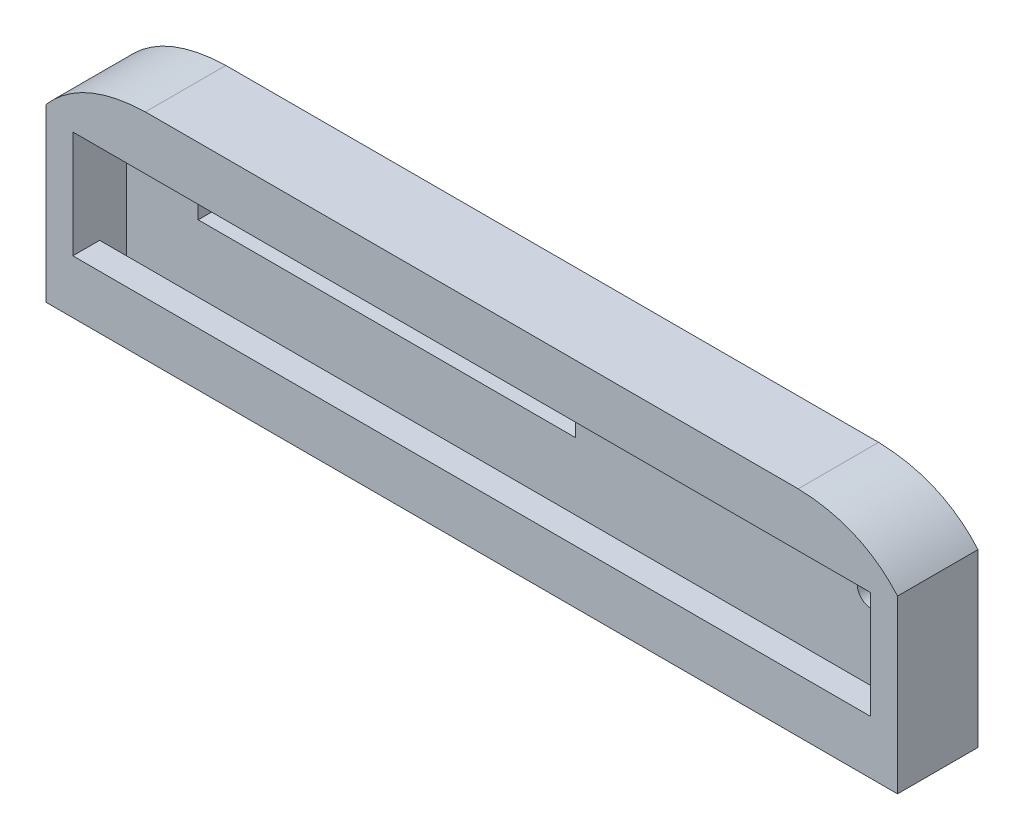
ISO-10303-21;
HEADER;
FILE_DESCRIPTION(('STEP AP214'),'2;1');
FILE_NAME('part.step','',(''),(''),'','','');
FILE_SCHEMA(('AUTOMOTIVE_DESIGN { 1 0 10303 214 1 1 1 1 }'));
ENDSEC;
DATA;
#1=APPLICATION_CONTEXT('core data for automotive mechanical design processes');
#2=APPLICATION_PROTOCOL_DEFINITION('international standard','automotive_design',2000,#1);
#3=PRODUCT_CONTEXT('',#1,'mechanical');
#4=PRODUCT('Part','Part','',(#3));
#5=PRODUCT_RELATED_PRODUCT_CATEGORY('part','',(#4));
#6=PRODUCT_DEFINITION_FORMATION('','',#4);
#7=PRODUCT_DEFINITION_CONTEXT('part definition',#1,'design');
#8=PRODUCT_DEFINITION('design','',#6,#7);
#9=PRODUCT_DEFINITION_SHAPE('','',#8);
#10=(LENGTH_UNIT() NAMED_UNIT(*) SI_UNIT(.MILLI.,.METRE.));
#11=(NAMED_UNIT(*) PLANE_ANGLE_UNIT() SI_UNIT($,.RADIAN.));
#12=(NAMED_UNIT(*) SI_UNIT($,.STERADIAN.) SOLID_ANGLE_UNIT());
#13=UNCERTAINTY_MEASURE_WITH_UNIT(LENGTH_MEASURE(1.E-05),#10,'distance_accuracy_value','');
#14=(GEOMETRIC_REPRESENTATION_CONTEXT(3) GLOBAL_UNCERTAINTY_ASSIGNED_CONTEXT((#13)) GLOBAL_UNIT_ASSIGNED_CONTEXT((#10,
#11,#12)) REPRESENTATION_CONTEXT('',''));
#15=CARTESIAN_POINT('',(0.,0.,0.));
#16=DIRECTION('',(0.,0.,1.));
#17=DIRECTION('',(1.,0.,0.));
#18=AXIS2_PLACEMENT_3D('',#15,#16,#17);
#19=CARTESIAN_POINT('',(31.75,-8.,2.));
#20=DIRECTION('',(-1.,0.,0.));
#21=DIRECTION('',(0.,0.,1.));
#22=AXIS2_PLACEMENT_3D('',#19,#20,#21);
#23=PLANE('',#22);
#24=DIRECTION('',(0.,0.,-1.));
#25=VECTOR('',#24,1.);
#26=CARTESIAN_POINT('',(31.75,4.77723529661171,6.));
#27=LINE('',#26,#25);
#28=CARTESIAN_POINT('',(31.75,4.77723529661171,6.));
#29=VERTEX_POINT('',#28);
#30=CARTESIAN_POINT('',(31.75,4.77723529661171,-1.49186218934005E-13));
#31=VERTEX_POINT('',#30);
#32=EDGE_CURVE('E171',#29,#31,#27,.T.);
#33=ORIENTED_EDGE('',*,*,#32,.F.);
#34=DIRECTION('',(0.,1.,0.));
#35=VECTOR('',#34,1.);
#36=CARTESIAN_POINT('',(31.75,8.,6.));
#37=LINE('',#36,#35);
#38=CARTESIAN_POINT('',(31.75,-8.,6.));
#39=VERTEX_POINT('',#38);
#40=EDGE_CURVE('E183',#39,#29,#37,.T.);
#41=ORIENTED_EDGE('',*,*,#40,.F.);
#42=DIRECTION('',(0.,0.,-1.));
#43=VECTOR('',#42,1.);
#44=CARTESIAN_POINT('',(31.75,-8.,2.));
#45=LINE('',#44,#43);
#46=CARTESIAN_POINT('',(31.75,-8.,0.));
#47=VERTEX_POINT('',#46);
#48=EDGE_CURVE('E267',#39,#47,#45,.T.);
#49=ORIENTED_EDGE('',*,*,#48,.T.);
#50=DIRECTION('',(0.,1.,0.));
#51=VECTOR('',#50,1.);
#52=CARTESIAN_POINT('',(31.75,-8.,0.));
#53=LINE('',#52,#51);
#54=EDGE_CURVE('E185',#47,#31,#53,.T.);
#55=ORIENTED_EDGE('',*,*,#54,.T.);
#56=EDGE_LOOP('',(#33,#41,#49,#55));
#57=FACE_BOUND('',#56,.T.);
#58=ADVANCED_FACE('F45',(#57),#23,.F.);
#59=CARTESIAN_POINT('',(-31.75,8.,2.));
#60=DIRECTION('',(0.,-1.,0.));
#61=DIRECTION('',(0.,0.,-1.));
#62=AXIS2_PLACEMENT_3D('',#59,#60,#61);
#63=PLANE('',#62);
#64=DIRECTION('',(0.,0.,-1.));
#65=VECTOR('',#64,1.);
#66=CARTESIAN_POINT('',(24.3400578712769,8.00000000000037,6.));
#67=LINE('',#66,#65);
#68=CARTESIAN_POINT('',(24.3400578712895,8.,6.));
#69=VERTEX_POINT('',#68);
#70=CARTESIAN_POINT('',(24.3400578712769,8.00000000000037,-1.49186218934005E-13));
#71=VERTEX_POINT('',#70);
#72=EDGE_CURVE('E60',#69,#71,#67,.T.);
#73=ORIENTED_EDGE('',*,*,#72,.T.);
#74=DIRECTION('',(-1.,0.,0.));
#75=VECTOR('',#74,1.);
#76=CARTESIAN_POINT('',(-31.75,8.,0.));
#77=LINE('',#76,#75);
#78=CARTESIAN_POINT('',(-24.3400578712769,8.00000000000037,-1.49186218934005E-13));
#79=VERTEX_POINT('',#78);
#80=EDGE_CURVE('E258',#71,#79,#77,.T.);
#81=ORIENTED_EDGE('',*,*,#80,.T.);
#82=DIRECTION('',(0.,0.,-1.));
#83=VECTOR('',#82,1.);
#84=CARTESIAN_POINT('',(-24.3400578712769,8.00000000000037,6.));
#85=LINE('',#84,#83);
#86=CARTESIAN_POINT('',(-24.3400578712769,8.00000000000037,6.));
#87=VERTEX_POINT('',#86);
#88=EDGE_CURVE('E598',#87,#79,#85,.T.);
#89=ORIENTED_EDGE('',*,*,#88,.F.);
#90=DIRECTION('',(-1.,0.,0.));
#91=VECTOR('',#90,1.);
#92=CARTESIAN_POINT('',(-31.75,8.,6.));
#93=LINE('',#92,#91);
#94=EDGE_CURVE('E193',#69,#87,#93,.T.);
#95=ORIENTED_EDGE('',*,*,#94,.F.);
#96=EDGE_LOOP('',(#73,#81,#89,#95));
#97=FACE_BOUND('',#96,.T.);
#98=ADVANCED_FACE('F400',(#97),#63,.F.);
#99=CARTESIAN_POINT('',(0.,0.,0.));
#100=DIRECTION('',(0.,0.,-1.));
#101=DIRECTION('',(-1.,0.,0.));
#102=AXIS2_PLACEMENT_3D('',#99,#100,#101);
#103=PLANE('',#102);
#104=DIRECTION('',(0.,-1.,0.));
#105=VECTOR('',#104,1.);
#106=CARTESIAN_POINT('',(3.74999999999999,-1.,0.));
#107=LINE('',#106,#105);
#108=CARTESIAN_POINT('',(3.74999999999999,1.,0.));
#109=VERTEX_POINT('',#108);
#110=CARTESIAN_POINT('',(3.74999999999999,-1.,0.));
#111=VERTEX_POINT('',#110);
#112=EDGE_CURVE('E611',#109,#111,#107,.T.);
#113=ORIENTED_EDGE('',*,*,#112,.F.);
#114=DIRECTION('',(1.,0.,0.));
#115=VECTOR('',#114,1.);
#116=CARTESIAN_POINT('',(3.74999999999999,1.,0.));
#117=LINE('',#116,#115);
#118=CARTESIAN_POINT('',(-24.4,1.,0.));
#119=VERTEX_POINT('',#118);
#120=EDGE_CURVE('E314',#119,#109,#117,.T.);
#121=ORIENTED_EDGE('',*,*,#120,.F.);
#122=DIRECTION('',(0.,1.,0.));
#123=VECTOR('',#122,1.);
#124=CARTESIAN_POINT('',(-24.4,-1.,0.));
#125=LINE('',#124,#123);
#126=CARTESIAN_POINT('',(-24.4,-1.,0.));
#127=VERTEX_POINT('',#126);
#128=EDGE_CURVE('E298',#127,#119,#125,.T.);
#129=ORIENTED_EDGE('',*,*,#128,.F.);
#130=DIRECTION('',(-1.,0.,0.));
#131=VECTOR('',#130,1.);
#132=CARTESIAN_POINT('',(3.74999999999999,-1.,0.));
#133=LINE('',#132,#131);
#134=EDGE_CURVE('E617',#111,#127,#133,.T.);
#135=ORIENTED_EDGE('',*,*,#134,.F.);
#136=EDGE_LOOP('',(#113,#121,#129,#135));
#137=FACE_BOUND('',#136,.T.);
#138=CARTESIAN_POINT('',(25.75,0.,0.));
#139=DIRECTION('',(0.,0.,1.));
#140=DIRECTION('',(1.,0.,0.));
#141=AXIS2_PLACEMENT_3D('',#138,#139,#140);
#142=CIRCLE('',#141,1.);
#143=CARTESIAN_POINT('',(26.75,0.,0.));
#144=VERTEX_POINT('',#143);
#145=EDGE_CURVE('E315',#144,#144,#142,.T.);
#146=ORIENTED_EDGE('',*,*,#145,.T.);
#147=EDGE_LOOP('',(#146));
#148=FACE_BOUND('',#147,.T.);
#149=ORIENTED_EDGE('',*,*,#80,.F.);
#150=CARTESIAN_POINT('',(23.4154374120693,8.00000000000037,-1.49186218934005E-13));
#151=CARTESIAN_POINT('',(28.8241821677392,8.15397580763855,-1.49186218934005E-13));
#152=CARTESIAN_POINT('',(31.75,4.77723529661171,-1.49186218934005E-13));
#153=B_SPLINE_CURVE_WITH_KNOTS('',2,(#150,#151,#152),.UNSPECIFIED.,.F.,.F.,(3,3),(0.,1.),.UNSPECIFIED.);
#154=EDGE_CURVE('E177',#71,#31,#153,.T.);
#155=ORIENTED_EDGE('',*,*,#154,.T.);
#156=ORIENTED_EDGE('',*,*,#54,.F.);
#157=DIRECTION('',(1.,0.,0.));
#158=VECTOR('',#157,1.);
#159=CARTESIAN_POINT('',(-31.75,-8.,0.));
#160=LINE('',#159,#158);
#161=CARTESIAN_POINT('',(-31.75,-8.,0.));
#162=VERTEX_POINT('',#161);
#163=EDGE_CURVE('E264',#162,#47,#160,.T.);
#164=ORIENTED_EDGE('',*,*,#163,.F.);
#165=DIRECTION('',(0.,-1.,0.));
#166=VECTOR('',#165,1.);
#167=CARTESIAN_POINT('',(-31.75,-8.,0.));
#168=LINE('',#167,#166);
#169=CARTESIAN_POINT('',(-31.75,4.77723529661171,-1.49186218934005E-13));
#170=VERTEX_POINT('',#169);
#171=EDGE_CURVE('E261',#170,#162,#168,.T.);
#172=ORIENTED_EDGE('',*,*,#171,.F.);
#173=CARTESIAN_POINT('',(-23.4154374120693,8.00000000000037,-1.49186218934005E-13));
#174=CARTESIAN_POINT('',(-28.8241821677392,8.15397580763855,-1.49186218934005E-13));
#175=CARTESIAN_POINT('',(-31.75,4.77723529661171,-1.49186218934005E-13));
#176=B_SPLINE_CURVE_WITH_KNOTS('',2,(#173,#174,#175),.UNSPECIFIED.,.F.,.F.,(3,3),(0.,1.),.UNSPECIFIED.);
#177=EDGE_CURVE('E591',#79,#170,#176,.T.);
#178=ORIENTED_EDGE('',*,*,#177,.F.);
#179=EDGE_LOOP('',(#149,#155,#156,#164,#172,#178));
#180=FACE_BOUND('',#179,.T.);
#181=ADVANCED_FACE('F390',(#137,#148,#180),#103,.T.);
#182=CARTESIAN_POINT('',(0.,0.,6.));
#183=DIRECTION('',(0.,0.,1.));
#184=DIRECTION('',(1.,0.,0.));
#185=AXIS2_PLACEMENT_3D('',#182,#183,#184);
#186=PLANE('',#185);
#187=DIRECTION('',(-1.,0.,0.));
#188=VECTOR('',#187,1.);
#189=CARTESIAN_POINT('',(-29.75,4.,6.));
#190=LINE('',#189,#188);
#191=CARTESIAN_POINT('',(29.75,4.,6.));
#192=VERTEX_POINT('',#191);
#193=CARTESIAN_POINT('',(-29.75,4.,6.));
#194=VERTEX_POINT('',#193);
#195=EDGE_CURVE('E326',#192,#194,#190,.T.);
#196=ORIENTED_EDGE('',*,*,#195,.F.);
#197=DIRECTION('',(0.,1.,0.));
#198=VECTOR('',#197,1.);
#199=CARTESIAN_POINT('',(29.75,4.,6.));
#200=LINE('',#199,#198);
#201=CARTESIAN_POINT('',(29.75,-4.,6.));
#202=VERTEX_POINT('',#201);
#203=EDGE_CURVE('E323',#202,#192,#200,.T.);
#204=ORIENTED_EDGE('',*,*,#203,.F.);
#205=DIRECTION('',(1.,0.,0.));
#206=VECTOR('',#205,1.);
#207=CARTESIAN_POINT('',(-29.75,-4.,6.));
#208=LINE('',#207,#206);
#209=CARTESIAN_POINT('',(-29.75,-4.,6.));
#210=VERTEX_POINT('',#209);
#211=EDGE_CURVE('E334',#210,#202,#208,.T.);
#212=ORIENTED_EDGE('',*,*,#211,.F.);
#213=DIRECTION('',(0.,-1.,0.));
#214=VECTOR('',#213,1.);
#215=CARTESIAN_POINT('',(-29.75,4.,6.));
#216=LINE('',#215,#214);
#217=EDGE_CURVE('E330',#194,#210,#216,.T.);
#218=ORIENTED_EDGE('',*,*,#217,.F.);
#219=EDGE_LOOP('',(#196,#204,#212,#218));
#220=FACE_BOUND('',#219,.T.);
#221=ORIENTED_EDGE('',*,*,#40,.T.);
#222=CARTESIAN_POINT('',(23.4154374120693,8.00000000000037,6.));
#223=CARTESIAN_POINT('',(28.8241821677392,8.15397580763855,6.));
#224=CARTESIAN_POINT('',(31.75,4.77723529661171,6.));
#225=B_SPLINE_CURVE_WITH_KNOTS('',2,(#222,#223,#224),.UNSPECIFIED.,.F.,.F.,(3,3),(0.,1.),.UNSPECIFIED.);
#226=EDGE_CURVE('E168',#69,#29,#225,.T.);
#227=ORIENTED_EDGE('',*,*,#226,.F.);
#228=ORIENTED_EDGE('',*,*,#94,.T.);
#229=CARTESIAN_POINT('',(-23.4154374120693,8.00000000000037,6.));
#230=CARTESIAN_POINT('',(-28.8241821677392,8.15397580763855,6.));
#231=CARTESIAN_POINT('',(-31.75,4.77723529661171,6.));
#232=B_SPLINE_CURVE_WITH_KNOTS('',2,(#229,#230,#231),.UNSPECIFIED.,.F.,.F.,(3,3),(0.,1.),.UNSPECIFIED.);
#233=CARTESIAN_POINT('',(-31.75,4.77723529661171,6.));
#234=VERTEX_POINT('',#233);
#235=EDGE_CURVE('E592',#87,#234,#232,.T.);
#236=ORIENTED_EDGE('',*,*,#235,.T.);
#237=DIRECTION('',(0.,-1.,0.));
#238=VECTOR('',#237,1.);
#239=CARTESIAN_POINT('',(-31.75,8.,6.));
#240=LINE('',#239,#238);
#241=CARTESIAN_POINT('',(-31.75,-8.,6.));
#242=VERTEX_POINT('',#241);
#243=EDGE_CURVE('E198',#234,#242,#240,.T.);
#244=ORIENTED_EDGE('',*,*,#243,.T.);
#245=DIRECTION('',(1.,0.,0.));
#246=VECTOR('',#245,1.);
#247=CARTESIAN_POINT('',(-31.75,-8.,6.));
#248=LINE('',#247,#246);
#249=EDGE_CURVE('E191',#242,#39,#248,.T.);
#250=ORIENTED_EDGE('',*,*,#249,.T.);
#251=EDGE_LOOP('',(#221,#227,#228,#236,#244,#250));
#252=FACE_BOUND('',#251,.T.);
#253=ADVANCED_FACE('F189',(#220,#252),#186,.T.);
#254=CARTESIAN_POINT('',(-31.75,-8.,2.));
#255=DIRECTION('',(1.,0.,0.));
#256=DIRECTION('',(0.,0.,-1.));
#257=AXIS2_PLACEMENT_3D('',#254,#255,#256);
#258=PLANE('',#257);
#259=ORIENTED_EDGE('',*,*,#243,.F.);
#260=DIRECTION('',(0.,0.,-1.));
#261=VECTOR('',#260,1.);
#262=CARTESIAN_POINT('',(-31.75,4.77723529661171,6.));
#263=LINE('',#262,#261);
#264=EDGE_CURVE('E68',#234,#170,#263,.T.);
#265=ORIENTED_EDGE('',*,*,#264,.T.);
#266=ORIENTED_EDGE('',*,*,#171,.T.);
#267=DIRECTION('',(0.,0.,-1.));
#268=VECTOR('',#267,1.);
#269=CARTESIAN_POINT('',(-31.75,-8.,2.));
#270=LINE('',#269,#268);
#271=EDGE_CURVE('E270',#242,#162,#270,.T.);
#272=ORIENTED_EDGE('',*,*,#271,.F.);
#273=EDGE_LOOP('',(#259,#265,#266,#272));
#274=FACE_BOUND('',#273,.T.);
#275=ADVANCED_FACE('F389',(#274),#258,.F.);
#276=CARTESIAN_POINT('',(-31.75,-8.,2.));
#277=DIRECTION('',(0.,1.,0.));
#278=DIRECTION('',(0.,0.,1.));
#279=AXIS2_PLACEMENT_3D('',#276,#277,#278);
#280=PLANE('',#279);
#281=ORIENTED_EDGE('',*,*,#163,.T.);
#282=ORIENTED_EDGE('',*,*,#48,.F.);
#283=ORIENTED_EDGE('',*,*,#249,.F.);
#284=ORIENTED_EDGE('',*,*,#271,.T.);
#285=EDGE_LOOP('',(#281,#282,#283,#284));
#286=FACE_BOUND('',#285,.T.);
#287=ADVANCED_FACE('F397',(#286),#280,.F.);
#288=CARTESIAN_POINT('',(0.,0.,4.));
#289=DIRECTION('',(0.,0.,1.));
#290=DIRECTION('',(1.,0.,0.));
#291=AXIS2_PLACEMENT_3D('',#288,#289,#290);
#292=PLANE('',#291);
#293=DIRECTION('',(0.,1.,0.));
#294=VECTOR('',#293,1.);
#295=CARTESIAN_POINT('',(29.75,6.,4.));
#296=LINE('',#295,#294);
#297=CARTESIAN_POINT('',(29.75,4.,4.));
#298=VERTEX_POINT('',#297);
#299=CARTESIAN_POINT('',(29.75,6.,4.));
#300=VERTEX_POINT('',#299);
#301=EDGE_CURVE('E215',#298,#300,#296,.T.);
#302=ORIENTED_EDGE('',*,*,#301,.F.);
#303=DIRECTION('',(-1.,0.,0.));
#304=VECTOR('',#303,1.);
#305=CARTESIAN_POINT('',(-29.75,4.,4.));
#306=LINE('',#305,#304);
#307=CARTESIAN_POINT('',(-29.75,4.,4.));
#308=VERTEX_POINT('',#307);
#309=EDGE_CURVE('E319',#298,#308,#306,.T.);
#310=ORIENTED_EDGE('',*,*,#309,.T.);
#311=DIRECTION('',(0.,-1.,0.));
#312=VECTOR('',#311,1.);
#313=CARTESIAN_POINT('',(-29.75,6.,4.));
#314=LINE('',#313,#312);
#315=CARTESIAN_POINT('',(-29.75,6.,4.));
#316=VERTEX_POINT('',#315);
#317=EDGE_CURVE('E220',#316,#308,#314,.T.);
#318=ORIENTED_EDGE('',*,*,#317,.F.);
#319=DIRECTION('',(-1.,0.,0.));
#320=VECTOR('',#319,1.);
#321=CARTESIAN_POINT('',(-29.75,6.,4.));
#322=LINE('',#321,#320);
#323=EDGE_CURVE('E214',#300,#316,#322,.T.);
#324=ORIENTED_EDGE('',*,*,#323,.F.);
#325=EDGE_LOOP('',(#302,#310,#318,#324));
#326=FACE_BOUND('',#325,.T.);
#327=ADVANCED_FACE('F359',(#326),#292,.F.);
#328=CARTESIAN_POINT('',(29.75,-6.,4.));
#329=VERTEX_POINT('',#328);
#330=CARTESIAN_POINT('',(29.75,-4.,4.));
#331=VERTEX_POINT('',#330);
#332=EDGE_CURVE('E210',#329,#331,#296,.T.);
#333=ORIENTED_EDGE('',*,*,#332,.F.);
#334=DIRECTION('',(1.,0.,0.));
#335=VECTOR('',#334,1.);
#336=CARTESIAN_POINT('',(-29.75,-6.,4.));
#337=LINE('',#336,#335);
#338=CARTESIAN_POINT('',(-29.75,-6.,4.));
#339=VERTEX_POINT('',#338);
#340=EDGE_CURVE('E224',#339,#329,#337,.T.);
#341=ORIENTED_EDGE('',*,*,#340,.F.);
#342=CARTESIAN_POINT('',(-29.75,-4.,4.));
#343=VERTEX_POINT('',#342);
#344=EDGE_CURVE('E219',#343,#339,#314,.T.);
#345=ORIENTED_EDGE('',*,*,#344,.F.);
#346=DIRECTION('',(1.,0.,0.));
#347=VECTOR('',#346,1.);
#348=CARTESIAN_POINT('',(-29.75,-4.,4.));
#349=LINE('',#348,#347);
#350=EDGE_CURVE('E327',#343,#331,#349,.T.);
#351=ORIENTED_EDGE('',*,*,#350,.T.);
#352=EDGE_LOOP('',(#333,#341,#345,#351));
#353=FACE_BOUND('',#352,.T.);
#354=ADVANCED_FACE('F383',(#353),#292,.F.);
#355=CARTESIAN_POINT('',(-29.75,4.,6.));
#356=DIRECTION('',(0.,-1.,0.));
#357=DIRECTION('',(0.,0.,-1.));
#358=AXIS2_PLACEMENT_3D('',#355,#356,#357);
#359=PLANE('',#358);
#360=ORIENTED_EDGE('',*,*,#309,.F.);
#361=DIRECTION('',(0.,0.,-1.));
#362=VECTOR('',#361,1.);
#363=CARTESIAN_POINT('',(29.75,4.,6.));
#364=LINE('',#363,#362);
#365=EDGE_CURVE('E194',#192,#298,#364,.T.);
#366=ORIENTED_EDGE('',*,*,#365,.F.);
#367=ORIENTED_EDGE('',*,*,#195,.T.);
#368=DIRECTION('',(0.,0.,-1.));
#369=VECTOR('',#368,1.);
#370=CARTESIAN_POINT('',(-29.75,4.,6.));
#371=LINE('',#370,#369);
#372=EDGE_CURVE('E201',#194,#308,#371,.T.);
#373=ORIENTED_EDGE('',*,*,#372,.T.);
#374=EDGE_LOOP('',(#360,#366,#367,#373));
#375=FACE_BOUND('',#374,.T.);
#376=ADVANCED_FACE('F353',(#375),#359,.T.);
#377=CARTESIAN_POINT('',(-29.75,-4.,6.));
#378=DIRECTION('',(0.,1.,0.));
#379=DIRECTION('',(0.,0.,1.));
#380=AXIS2_PLACEMENT_3D('',#377,#378,#379);
#381=PLANE('',#380);
#382=ORIENTED_EDGE('',*,*,#350,.F.);
#383=DIRECTION('',(0.,0.,-1.));
#384=VECTOR('',#383,1.);
#385=CARTESIAN_POINT('',(-29.75,-4.,6.));
#386=LINE('',#385,#384);
#387=EDGE_CURVE('E346',#210,#343,#386,.T.);
#388=ORIENTED_EDGE('',*,*,#387,.F.);
#389=ORIENTED_EDGE('',*,*,#211,.T.);
#390=DIRECTION('',(0.,0.,-1.));
#391=VECTOR('',#390,1.);
#392=CARTESIAN_POINT('',(29.75,-4.,6.));
#393=LINE('',#392,#391);
#394=EDGE_CURVE('E337',#202,#331,#393,.T.);
#395=ORIENTED_EDGE('',*,*,#394,.T.);
#396=EDGE_LOOP('',(#382,#388,#389,#395));
#397=FACE_BOUND('',#396,.T.);
#398=ADVANCED_FACE('F385',(#397),#381,.T.);
#399=CARTESIAN_POINT('',(0.,0.,2.));
#400=DIRECTION('',(0.,0.,-1.));
#401=DIRECTION('',(-1.,0.,0.));
#402=AXIS2_PLACEMENT_3D('',#399,#400,#401);
#403=PLANE('',#402);
#404=DIRECTION('',(1.,0.,0.));
#405=VECTOR('',#404,1.);
#406=CARTESIAN_POINT('',(0.,1.,2.));
#407=LINE('',#406,#405);
#408=CARTESIAN_POINT('',(-24.4,1.,2.));
#409=VERTEX_POINT('',#408);
#410=CARTESIAN_POINT('',(3.74999999999999,1.,2.));
#411=VERTEX_POINT('',#410);
#412=EDGE_CURVE('E53',#409,#411,#407,.T.);
#413=ORIENTED_EDGE('',*,*,#412,.T.);
#414=DIRECTION('',(0.,-1.,0.));
#415=VECTOR('',#414,1.);
#416=CARTESIAN_POINT('',(3.74999999999999,0.,2.));
#417=LINE('',#416,#415);
#418=CARTESIAN_POINT('',(3.74999999999999,-1.,2.));
#419=VERTEX_POINT('',#418);
#420=EDGE_CURVE('E11',#411,#419,#417,.T.);
#421=ORIENTED_EDGE('',*,*,#420,.T.);
#422=DIRECTION('',(-1.,0.,0.));
#423=VECTOR('',#422,1.);
#424=CARTESIAN_POINT('',(0.,-1.,2.));
#425=LINE('',#424,#423);
#426=CARTESIAN_POINT('',(-24.4,-1.,2.));
#427=VERTEX_POINT('',#426);
#428=EDGE_CURVE('E274',#419,#427,#425,.T.);
#429=ORIENTED_EDGE('',*,*,#428,.T.);
#430=DIRECTION('',(0.,1.,0.));
#431=VECTOR('',#430,1.);
#432=CARTESIAN_POINT('',(-24.4,0.,2.));
#433=LINE('',#432,#431);
#434=EDGE_CURVE('E278',#427,#409,#433,.T.);
#435=ORIENTED_EDGE('',*,*,#434,.T.);
#436=EDGE_LOOP('',(#413,#421,#429,#435));
#437=FACE_BOUND('',#436,.T.);
#438=CARTESIAN_POINT('',(25.75,0.,2.));
#439=DIRECTION('',(0.,0.,1.));
#440=DIRECTION('',(1.,0.,0.));
#441=AXIS2_PLACEMENT_3D('',#438,#439,#440);
#442=CIRCLE('',#441,1.);
#443=CARTESIAN_POINT('',(26.75,0.,2.));
#444=VERTEX_POINT('',#443);
#445=EDGE_CURVE('E305',#444,#444,#442,.T.);
#446=ORIENTED_EDGE('',*,*,#445,.F.);
#447=EDGE_LOOP('',(#446));
#448=FACE_BOUND('',#447,.T.);
#449=DIRECTION('',(1.,0.,0.));
#450=VECTOR('',#449,1.);
#451=CARTESIAN_POINT('',(-29.75,-6.,2.));
#452=LINE('',#451,#450);
#453=CARTESIAN_POINT('',(-29.75,-6.,2.));
#454=VERTEX_POINT('',#453);
#455=CARTESIAN_POINT('',(29.75,-6.,2.));
#456=VERTEX_POINT('',#455);
#457=EDGE_CURVE('E240',#454,#456,#452,.T.);
#458=ORIENTED_EDGE('',*,*,#457,.T.);
#459=DIRECTION('',(0.,1.,0.));
#460=VECTOR('',#459,1.);
#461=CARTESIAN_POINT('',(29.75,6.,2.));
#462=LINE('',#461,#460);
#463=CARTESIAN_POINT('',(29.75,6.,2.));
#464=VERTEX_POINT('',#463);
#465=EDGE_CURVE('E209',#456,#464,#462,.T.);
#466=ORIENTED_EDGE('',*,*,#465,.T.);
#467=DIRECTION('',(-1.,0.,0.));
#468=VECTOR('',#467,1.);
#469=CARTESIAN_POINT('',(-29.75,6.,2.));
#470=LINE('',#469,#468);
#471=CARTESIAN_POINT('',(-29.75,6.,2.));
#472=VERTEX_POINT('',#471);
#473=EDGE_CURVE('E232',#464,#472,#470,.T.);
#474=ORIENTED_EDGE('',*,*,#473,.T.);
#475=DIRECTION('',(0.,-1.,0.));
#476=VECTOR('',#475,1.);
#477=CARTESIAN_POINT('',(-29.75,6.,2.));
#478=LINE('',#477,#476);
#479=EDGE_CURVE('E236',#472,#454,#478,.T.);
#480=ORIENTED_EDGE('',*,*,#479,.T.);
#481=EDGE_LOOP('',(#458,#466,#474,#480));
#482=FACE_BOUND('',#481,.T.);
#483=ADVANCED_FACE('F284',(#437,#448,#482),#403,.F.);
#484=CARTESIAN_POINT('',(-29.75,6.,4.));
#485=DIRECTION('',(1.,0.,0.));
#486=DIRECTION('',(0.,0.,-1.));
#487=AXIS2_PLACEMENT_3D('',#484,#485,#486);
#488=PLANE('',#487);
#489=ORIENTED_EDGE('',*,*,#479,.F.);
#490=DIRECTION('',(0.,0.,-1.));
#491=VECTOR('',#490,1.);
#492=CARTESIAN_POINT('',(-29.75,6.,4.));
#493=LINE('',#492,#491);
#494=EDGE_CURVE('E249',#316,#472,#493,.T.);
#495=ORIENTED_EDGE('',*,*,#494,.F.);
#496=ORIENTED_EDGE('',*,*,#317,.T.);
#497=ORIENTED_EDGE('',*,*,#372,.F.);
#498=ORIENTED_EDGE('',*,*,#217,.T.);
#499=ORIENTED_EDGE('',*,*,#387,.T.);
#500=ORIENTED_EDGE('',*,*,#344,.T.);
#501=DIRECTION('',(0.,0.,-1.));
#502=VECTOR('',#501,1.);
#503=CARTESIAN_POINT('',(-29.75,-6.,4.));
#504=LINE('',#503,#502);
#505=EDGE_CURVE('E246',#339,#454,#504,.T.);
#506=ORIENTED_EDGE('',*,*,#505,.T.);
#507=EDGE_LOOP('',(#489,#495,#496,#497,#498,#499,#500,#506));
#508=FACE_BOUND('',#507,.T.);
#509=ADVANCED_FACE('F363',(#508),#488,.T.);
#510=CARTESIAN_POINT('',(-29.75,-6.,4.));
#511=DIRECTION('',(0.,1.,0.));
#512=DIRECTION('',(0.,0.,1.));
#513=AXIS2_PLACEMENT_3D('',#510,#511,#512);
#514=PLANE('',#513);
#515=ORIENTED_EDGE('',*,*,#457,.F.);
#516=ORIENTED_EDGE('',*,*,#505,.F.);
#517=ORIENTED_EDGE('',*,*,#340,.T.);
#518=DIRECTION('',(0.,0.,-1.));
#519=VECTOR('',#518,1.);
#520=CARTESIAN_POINT('',(29.75,-6.,4.));
#521=LINE('',#520,#519);
#522=EDGE_CURVE('E228',#329,#456,#521,.T.);
#523=ORIENTED_EDGE('',*,*,#522,.T.);
#524=EDGE_LOOP('',(#515,#516,#517,#523));
#525=FACE_BOUND('',#524,.T.);
#526=ADVANCED_FACE('F378',(#525),#514,.T.);
#527=CARTESIAN_POINT('',(29.75,6.,4.));
#528=DIRECTION('',(-1.,0.,0.));
#529=DIRECTION('',(0.,0.,1.));
#530=AXIS2_PLACEMENT_3D('',#527,#528,#529);
#531=PLANE('',#530);
#532=ORIENTED_EDGE('',*,*,#465,.F.);
#533=ORIENTED_EDGE('',*,*,#522,.F.);
#534=ORIENTED_EDGE('',*,*,#332,.T.);
#535=ORIENTED_EDGE('',*,*,#394,.F.);
#536=ORIENTED_EDGE('',*,*,#203,.T.);
#537=ORIENTED_EDGE('',*,*,#365,.T.);
#538=ORIENTED_EDGE('',*,*,#301,.T.);
#539=DIRECTION('',(0.,0.,-1.));
#540=VECTOR('',#539,1.);
#541=CARTESIAN_POINT('',(29.75,6.,4.));
#542=LINE('',#541,#540);
#543=EDGE_CURVE('E252',#300,#464,#542,.T.);
#544=ORIENTED_EDGE('',*,*,#543,.T.);
#545=EDGE_LOOP('',(#532,#533,#534,#535,#536,#537,#538,#544));
#546=FACE_BOUND('',#545,.T.);
#547=ADVANCED_FACE('F369',(#546),#531,.T.);
#548=CARTESIAN_POINT('',(-29.75,6.,4.));
#549=DIRECTION('',(0.,-1.,0.));
#550=DIRECTION('',(0.,0.,-1.));
#551=AXIS2_PLACEMENT_3D('',#548,#549,#550);
#552=PLANE('',#551);
#553=ORIENTED_EDGE('',*,*,#473,.F.);
#554=ORIENTED_EDGE('',*,*,#543,.F.);
#555=ORIENTED_EDGE('',*,*,#323,.T.);
#556=ORIENTED_EDGE('',*,*,#494,.T.);
#557=EDGE_LOOP('',(#553,#554,#555,#556));
#558=FACE_BOUND('',#557,.T.);
#559=ADVANCED_FACE('F365',(#558),#552,.T.);
#560=CARTESIAN_POINT('',(25.75,0.,0.));
#561=DIRECTION('',(0.,0.,1.));
#562=DIRECTION('',(1.,0.,0.));
#563=AXIS2_PLACEMENT_3D('',#560,#561,#562);
#564=CYLINDRICAL_SURFACE('',#563,1.);
#565=ORIENTED_EDGE('',*,*,#145,.F.);
#566=EDGE_LOOP('',(#565));
#567=FACE_BOUND('',#566,.T.);
#568=ORIENTED_EDGE('',*,*,#445,.T.);
#569=EDGE_LOOP('',(#568));
#570=FACE_BOUND('',#569,.T.);
#571=ADVANCED_FACE('F423',(#567,#570),#564,.F.);
#572=CARTESIAN_POINT('',(3.74999999999999,-1.,6.));
#573=DIRECTION('',(1.,0.,0.));
#574=DIRECTION('',(0.,0.,-1.));
#575=AXIS2_PLACEMENT_3D('',#572,#573,#574);
#576=PLANE('',#575);
#577=DIRECTION('',(0.,0.,-1.));
#578=VECTOR('',#577,1.);
#579=CARTESIAN_POINT('',(3.74999999999999,1.,6.));
#580=LINE('',#579,#578);
#581=EDGE_CURVE('E294',#411,#109,#580,.T.);
#582=ORIENTED_EDGE('',*,*,#581,.T.);
#583=ORIENTED_EDGE('',*,*,#112,.T.);
#584=DIRECTION('',(0.,0.,-1.));
#585=VECTOR('',#584,1.);
#586=CARTESIAN_POINT('',(3.74999999999999,-1.,6.));
#587=LINE('',#586,#585);
#588=EDGE_CURVE('E307',#419,#111,#587,.T.);
#589=ORIENTED_EDGE('',*,*,#588,.F.);
#590=ORIENTED_EDGE('',*,*,#420,.F.);
#591=EDGE_LOOP('',(#582,#583,#589,#590));
#592=FACE_BOUND('',#591,.T.);
#593=ADVANCED_FACE('F492',(#592),#576,.F.);
#594=CARTESIAN_POINT('',(3.74999999999999,1.,6.));
#595=DIRECTION('',(0.,1.,0.));
#596=DIRECTION('',(0.,0.,1.));
#597=AXIS2_PLACEMENT_3D('',#594,#595,#596);
#598=PLANE('',#597);
#599=DIRECTION('',(0.,0.,-1.));
#600=VECTOR('',#599,1.);
#601=CARTESIAN_POINT('',(-24.4,1.,6.));
#602=LINE('',#601,#600);
#603=EDGE_CURVE('E292',#409,#119,#602,.T.);
#604=ORIENTED_EDGE('',*,*,#603,.T.);
#605=ORIENTED_EDGE('',*,*,#120,.T.);
#606=ORIENTED_EDGE('',*,*,#581,.F.);
#607=ORIENTED_EDGE('',*,*,#412,.F.);
#608=EDGE_LOOP('',(#604,#605,#606,#607));
#609=FACE_BOUND('',#608,.T.);
#610=ADVANCED_FACE('F290',(#609),#598,.F.);
#611=CARTESIAN_POINT('',(-24.4,-1.,6.));
#612=DIRECTION('',(-1.,0.,0.));
#613=DIRECTION('',(0.,0.,1.));
#614=AXIS2_PLACEMENT_3D('',#611,#612,#613);
#615=PLANE('',#614);
#616=DIRECTION('',(0.,0.,-1.));
#617=VECTOR('',#616,1.);
#618=CARTESIAN_POINT('',(-24.4,-1.,6.));
#619=LINE('',#618,#617);
#620=EDGE_CURVE('E301',#427,#127,#619,.T.);
#621=ORIENTED_EDGE('',*,*,#620,.T.);
#622=ORIENTED_EDGE('',*,*,#128,.T.);
#623=ORIENTED_EDGE('',*,*,#603,.F.);
#624=ORIENTED_EDGE('',*,*,#434,.F.);
#625=EDGE_LOOP('',(#621,#622,#623,#624));
#626=FACE_BOUND('',#625,.T.);
#627=ADVANCED_FACE('F296',(#626),#615,.F.);
#628=CARTESIAN_POINT('',(3.74999999999999,-1.,6.));
#629=DIRECTION('',(0.,-1.,0.));
#630=DIRECTION('',(0.,0.,-1.));
#631=AXIS2_PLACEMENT_3D('',#628,#629,#630);
#632=PLANE('',#631);
#633=ORIENTED_EDGE('',*,*,#588,.T.);
#634=ORIENTED_EDGE('',*,*,#134,.T.);
#635=ORIENTED_EDGE('',*,*,#620,.F.);
#636=ORIENTED_EDGE('',*,*,#428,.F.);
#637=EDGE_LOOP('',(#633,#634,#635,#636));
#638=FACE_BOUND('',#637,.T.);
#639=ADVANCED_FACE('F520',(#638),#632,.F.);
#640=DIRECTION('',(0.,0.,-1.));
#641=VECTOR('',#640,1.);
#642=SURFACE_OF_LINEAR_EXTRUSION('',#232,#641);
#643=ORIENTED_EDGE('',*,*,#177,.T.);
#644=ORIENTED_EDGE('',*,*,#264,.F.);
#645=ORIENTED_EDGE('',*,*,#235,.F.);
#646=ORIENTED_EDGE('',*,*,#88,.T.);
#647=EDGE_LOOP('',(#643,#644,#645,#646));
#648=FACE_BOUND('',#647,.T.);
#649=ADVANCED_FACE('F528',(#648),#642,.F.);
#650=DIRECTION('',(0.,0.,-1.));
#651=VECTOR('',#650,1.);
#652=SURFACE_OF_LINEAR_EXTRUSION('',#225,#651);
#653=ORIENTED_EDGE('',*,*,#154,.F.);
#654=ORIENTED_EDGE('',*,*,#72,.F.);
#655=ORIENTED_EDGE('',*,*,#226,.T.);
#656=ORIENTED_EDGE('',*,*,#32,.T.);
#657=EDGE_LOOP('',(#653,#654,#655,#656));
#658=FACE_BOUND('',#657,.T.);
#659=ADVANCED_FACE('F170',(#658),#652,.T.);
#660=CLOSED_SHELL('',(#58,#98,#181,#253,#275,#287,#327,#354,#376,#398,#483,#509,#526,#547,#559,
#571,#593,#610,#627,#639,#649,#659));
#661=MANIFOLD_SOLID_BREP('B2',#660);
#662=ADVANCED_BREP_SHAPE_REPRESENTATION('',(#18,#661),#14);
#663=SHAPE_DEFINITION_REPRESENTATION(#9,#662);
ENDSEC;
END-ISO-10303-21;
